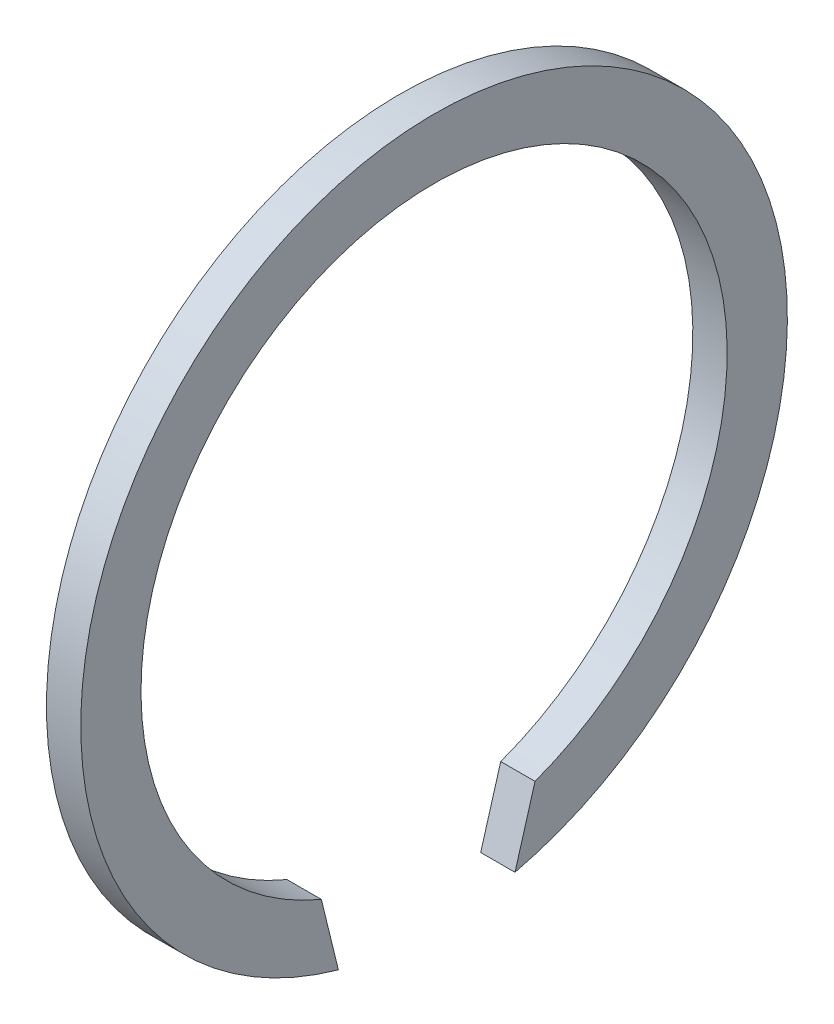
ISO-10303-21;
HEADER;
FILE_DESCRIPTION(('STEP AP214'),'2;1');
FILE_NAME('part.step','',(''),(''),'','','');
FILE_SCHEMA(('AUTOMOTIVE_DESIGN { 1 0 10303 214 1 1 1 1 }'));
ENDSEC;
DATA;
#1=APPLICATION_CONTEXT('core data for automotive mechanical design processes');
#2=APPLICATION_PROTOCOL_DEFINITION('international standard','automotive_design',2000,#1);
#3=PRODUCT_CONTEXT('',#1,'mechanical');
#4=PRODUCT('Part','Part','',(#3));
#5=PRODUCT_RELATED_PRODUCT_CATEGORY('part','',(#4));
#6=PRODUCT_DEFINITION_FORMATION('','',#4);
#7=PRODUCT_DEFINITION_CONTEXT('part definition',#1,'design');
#8=PRODUCT_DEFINITION('design','',#6,#7);
#9=PRODUCT_DEFINITION_SHAPE('','',#8);
#10=(LENGTH_UNIT() NAMED_UNIT(*) SI_UNIT(.MILLI.,.METRE.));
#11=(NAMED_UNIT(*) PLANE_ANGLE_UNIT() SI_UNIT($,.RADIAN.));
#12=(NAMED_UNIT(*) SI_UNIT($,.STERADIAN.) SOLID_ANGLE_UNIT());
#13=UNCERTAINTY_MEASURE_WITH_UNIT(LENGTH_MEASURE(1.E-05),#10,'distance_accuracy_value','');
#14=(GEOMETRIC_REPRESENTATION_CONTEXT(3) GLOBAL_UNCERTAINTY_ASSIGNED_CONTEXT((#13)) GLOBAL_UNIT_ASSIGNED_CONTEXT((#10,
#11,#12)) REPRESENTATION_CONTEXT('',''));
#15=CARTESIAN_POINT('',(0.,0.,0.));
#16=DIRECTION('',(0.,0.,1.));
#17=DIRECTION('',(1.,0.,0.));
#18=AXIS2_PLACEMENT_3D('',#15,#16,#17);
#19=CARTESIAN_POINT('',(-26.,0.,0.));
#20=DIRECTION('',(-1.,0.,0.));
#21=DIRECTION('',(0.,-0.999766601856238,0.0216042082203893));
#22=AXIS2_PLACEMENT_3D('',#19,#20,#21);
#23=PLANE('',#22);
#24=CARTESIAN_POINT('',(-26.,0.,0.));
#25=DIRECTION('',(-1.,0.,0.));
#26=DIRECTION('',(0.,-0.999766601856238,0.0216042082203893));
#27=AXIS2_PLACEMENT_3D('',#24,#25,#26);
#28=CIRCLE('',#27,9.68);
#29=CARTESIAN_POINT('',(-26.,-9.31814996188895,2.62192320401436));
#30=VERTEX_POINT('',#29);
#31=CARTESIAN_POINT('',(-26.,-9.42271432967564,-2.21694714896983));
#32=VERTEX_POINT('',#31);
#33=EDGE_CURVE('E82',#30,#32,#28,.T.);
#34=ORIENTED_EDGE('',*,*,#33,.F.);
#35=DIRECTION('',(0.,-0.971291961536,-0.237890574541217));
#36=VECTOR('',#35,1.);
#37=CARTESIAN_POINT('',(-26.,-9.31814996188895,2.62192320401436));
#38=LINE('',#37,#36);
#39=CARTESIAN_POINT('',(-26.,-7.41219447284651,3.08873325114095));
#40=VERTEX_POINT('',#39);
#41=EDGE_CURVE('E27',#40,#30,#38,.T.);
#42=ORIENTED_EDGE('',*,*,#41,.F.);
#43=CARTESIAN_POINT('',(-26.,0.,0.));
#44=DIRECTION('',(1.,0.,0.));
#45=DIRECTION('',(0.,-0.999766601856238,0.0216042082203893));
#46=AXIS2_PLACEMENT_3D('',#43,#44,#45);
#47=CIRCLE('',#46,8.03);
#48=CARTESIAN_POINT('',(-26.,-7.53870343411918,-2.7656555339376));
#49=VERTEX_POINT('',#48);
#50=EDGE_CURVE('E84',#49,#40,#47,.T.);
#51=ORIENTED_EDGE('',*,*,#50,.F.);
#52=DIRECTION('',(0.,0.960108800452405,-0.279626699894418));
#53=VECTOR('',#52,1.);
#54=CARTESIAN_POINT('',(-26.,-9.42271432967564,-2.21694714896983));
#55=LINE('',#54,#53);
#56=EDGE_CURVE('E80',#32,#49,#55,.T.);
#57=ORIENTED_EDGE('',*,*,#56,.F.);
#58=EDGE_LOOP('',(#34,#42,#51,#57));
#59=FACE_BOUND('',#58,.T.);
#60=ADVANCED_FACE('F17',(#59),#23,.F.);
#61=CARTESIAN_POINT('',(-26.94,0.,0.));
#62=DIRECTION('',(-1.,0.,0.));
#63=DIRECTION('',(0.,-0.999766601856238,0.0216042082203893));
#64=AXIS2_PLACEMENT_3D('',#61,#62,#63);
#65=PLANE('',#64);
#66=DIRECTION('',(0.,-0.971291961536,-0.237890574541217));
#67=VECTOR('',#66,1.);
#68=CARTESIAN_POINT('',(-26.94,-9.31814996188895,2.62192320401436));
#69=LINE('',#68,#67);
#70=CARTESIAN_POINT('',(-26.94,-7.41219447284651,3.08873325114095));
#71=VERTEX_POINT('',#70);
#72=CARTESIAN_POINT('',(-26.94,-9.31814996188895,2.62192320401436));
#73=VERTEX_POINT('',#72);
#74=EDGE_CURVE('E11',#71,#73,#69,.T.);
#75=ORIENTED_EDGE('',*,*,#74,.T.);
#76=CARTESIAN_POINT('',(-26.94,0.,0.));
#77=DIRECTION('',(-1.,0.,0.));
#78=DIRECTION('',(0.,-0.999766601856238,0.0216042082203893));
#79=AXIS2_PLACEMENT_3D('',#76,#77,#78);
#80=CIRCLE('',#79,9.68);
#81=CARTESIAN_POINT('',(-26.94,-9.42271432967564,-2.21694714896983));
#82=VERTEX_POINT('',#81);
#83=EDGE_CURVE('E98',#73,#82,#80,.T.);
#84=ORIENTED_EDGE('',*,*,#83,.T.);
#85=DIRECTION('',(0.,0.960108800452405,-0.279626699894418));
#86=VECTOR('',#85,1.);
#87=CARTESIAN_POINT('',(-26.94,-9.42271432967564,-2.21694714896983));
#88=LINE('',#87,#86);
#89=CARTESIAN_POINT('',(-26.94,-7.53870343411918,-2.7656555339376));
#90=VERTEX_POINT('',#89);
#91=EDGE_CURVE('E75',#82,#90,#88,.T.);
#92=ORIENTED_EDGE('',*,*,#91,.T.);
#93=CARTESIAN_POINT('',(-26.94,0.,0.));
#94=DIRECTION('',(1.,0.,0.));
#95=DIRECTION('',(0.,-0.999766601856238,0.0216042082203893));
#96=AXIS2_PLACEMENT_3D('',#93,#94,#95);
#97=CIRCLE('',#96,8.03);
#98=EDGE_CURVE('E40',#90,#71,#97,.T.);
#99=ORIENTED_EDGE('',*,*,#98,.T.);
#100=EDGE_LOOP('',(#75,#84,#92,#99));
#101=FACE_BOUND('',#100,.T.);
#102=ADVANCED_FACE('F142',(#101),#65,.T.);
#103=CARTESIAN_POINT('',(-26.94,-9.31814996188895,2.62192320401436));
#104=DIRECTION('',(0.,-0.237890574541217,0.971291961536));
#105=DIRECTION('',(0.,0.971291961536,0.237890574541217));
#106=AXIS2_PLACEMENT_3D('',#103,#104,#105);
#107=PLANE('',#106);
#108=ORIENTED_EDGE('',*,*,#41,.T.);
#109=DIRECTION('',(1.,0.,0.));
#110=VECTOR('',#109,1.);
#111=CARTESIAN_POINT('',(-26.94,-9.31814996188895,2.62192320401436));
#112=LINE('',#111,#110);
#113=EDGE_CURVE('E87',#73,#30,#112,.T.);
#114=ORIENTED_EDGE('',*,*,#113,.F.);
#115=ORIENTED_EDGE('',*,*,#74,.F.);
#116=DIRECTION('',(1.,0.,0.));
#117=VECTOR('',#116,1.);
#118=CARTESIAN_POINT('',(-26.94,-7.41219447284651,3.08873325114095));
#119=LINE('',#118,#117);
#120=EDGE_CURVE('E101',#71,#40,#119,.T.);
#121=ORIENTED_EDGE('',*,*,#120,.T.);
#122=EDGE_LOOP('',(#108,#114,#115,#121));
#123=FACE_BOUND('',#122,.T.);
#124=ADVANCED_FACE('F143',(#123),#107,.F.);
#125=CARTESIAN_POINT('',(-26.94,-9.42271432967564,-2.21694714896983));
#126=DIRECTION('',(0.,-0.279626699894418,-0.960108800452405));
#127=DIRECTION('',(0.,-0.960108800452405,0.279626699894418));
#128=AXIS2_PLACEMENT_3D('',#125,#126,#127);
#129=PLANE('',#128);
#130=ORIENTED_EDGE('',*,*,#56,.T.);
#131=DIRECTION('',(1.,0.,0.));
#132=VECTOR('',#131,1.);
#133=CARTESIAN_POINT('',(-26.94,-7.53870343411918,-2.7656555339376));
#134=LINE('',#133,#132);
#135=EDGE_CURVE('E86',#90,#49,#134,.T.);
#136=ORIENTED_EDGE('',*,*,#135,.F.);
#137=ORIENTED_EDGE('',*,*,#91,.F.);
#138=DIRECTION('',(1.,0.,0.));
#139=VECTOR('',#138,1.);
#140=CARTESIAN_POINT('',(-26.94,-9.42271432967564,-2.21694714896983));
#141=LINE('',#140,#139);
#142=EDGE_CURVE('E89',#82,#32,#141,.T.);
#143=ORIENTED_EDGE('',*,*,#142,.T.);
#144=EDGE_LOOP('',(#130,#136,#137,#143));
#145=FACE_BOUND('',#144,.T.);
#146=ADVANCED_FACE('F90',(#145),#129,.F.);
#147=CARTESIAN_POINT('',(-26.94,0.,0.));
#148=DIRECTION('',(1.,0.,0.));
#149=DIRECTION('',(0.,0.999766601856238,-0.0216042082203893));
#150=AXIS2_PLACEMENT_3D('',#147,#148,#149);
#151=CYLINDRICAL_SURFACE('',#150,9.68);
#152=ORIENTED_EDGE('',*,*,#83,.F.);
#153=ORIENTED_EDGE('',*,*,#113,.T.);
#154=ORIENTED_EDGE('',*,*,#33,.T.);
#155=ORIENTED_EDGE('',*,*,#142,.F.);
#156=EDGE_LOOP('',(#152,#153,#154,#155));
#157=FACE_BOUND('',#156,.T.);
#158=ADVANCED_FACE('F96',(#157),#151,.T.);
#159=CARTESIAN_POINT('',(-26.94,0.,0.));
#160=DIRECTION('',(1.,0.,0.));
#161=DIRECTION('',(0.,0.999766601856238,-0.0216042082203893));
#162=AXIS2_PLACEMENT_3D('',#159,#160,#161);
#163=CYLINDRICAL_SURFACE('',#162,8.03);
#164=ORIENTED_EDGE('',*,*,#98,.F.);
#165=ORIENTED_EDGE('',*,*,#135,.T.);
#166=ORIENTED_EDGE('',*,*,#50,.T.);
#167=ORIENTED_EDGE('',*,*,#120,.F.);
#168=EDGE_LOOP('',(#164,#165,#166,#167));
#169=FACE_BOUND('',#168,.T.);
#170=ADVANCED_FACE('F140',(#169),#163,.F.);
#171=CLOSED_SHELL('',(#60,#102,#124,#146,#158,#170));
#172=MANIFOLD_SOLID_BREP('B1',#171);
#173=ADVANCED_BREP_SHAPE_REPRESENTATION('',(#18,#172),#14);
#174=SHAPE_DEFINITION_REPRESENTATION(#9,#173);
ENDSEC;
END-ISO-10303-21;
